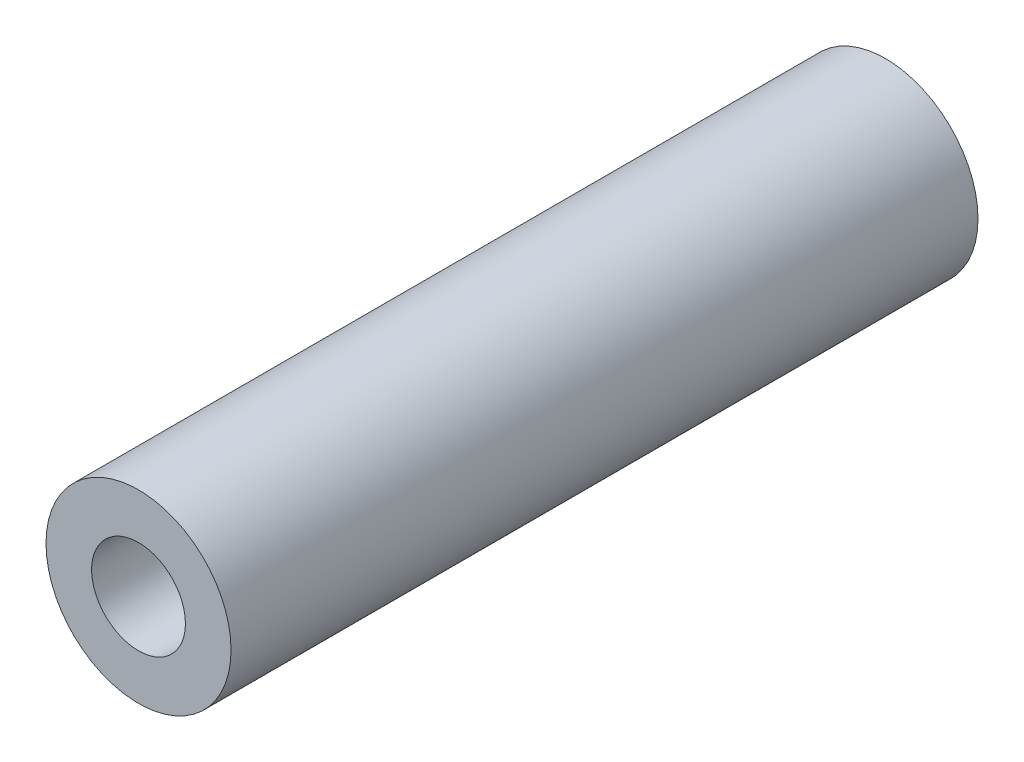
ISO-10303-21;
HEADER;
FILE_DESCRIPTION(('STEP AP214'),'2;1');
FILE_NAME('part.step','',(''),(''),'','','');
FILE_SCHEMA(('AUTOMOTIVE_DESIGN { 1 0 10303 214 1 1 1 1 }'));
ENDSEC;
DATA;
#1=APPLICATION_CONTEXT('core data for automotive mechanical design processes');
#2=APPLICATION_PROTOCOL_DEFINITION('international standard','automotive_design',2000,#1);
#3=PRODUCT_CONTEXT('',#1,'mechanical');
#4=PRODUCT('Part','Part','',(#3));
#5=PRODUCT_RELATED_PRODUCT_CATEGORY('part','',(#4));
#6=PRODUCT_DEFINITION_FORMATION('','',#4);
#7=PRODUCT_DEFINITION_CONTEXT('part definition',#1,'design');
#8=PRODUCT_DEFINITION('design','',#6,#7);
#9=PRODUCT_DEFINITION_SHAPE('','',#8);
#10=(LENGTH_UNIT() NAMED_UNIT(*) SI_UNIT(.MILLI.,.METRE.));
#11=(NAMED_UNIT(*) PLANE_ANGLE_UNIT() SI_UNIT($,.RADIAN.));
#12=(NAMED_UNIT(*) SI_UNIT($,.STERADIAN.) SOLID_ANGLE_UNIT());
#13=UNCERTAINTY_MEASURE_WITH_UNIT(LENGTH_MEASURE(1.E-05),#10,'distance_accuracy_value','');
#14=(GEOMETRIC_REPRESENTATION_CONTEXT(3) GLOBAL_UNCERTAINTY_ASSIGNED_CONTEXT((#13)) GLOBAL_UNIT_ASSIGNED_CONTEXT((#10,
#11,#12)) REPRESENTATION_CONTEXT('',''));
#15=CARTESIAN_POINT('',(0.,0.,0.));
#16=DIRECTION('',(0.,0.,1.));
#17=DIRECTION('',(1.,0.,0.));
#18=AXIS2_PLACEMENT_3D('',#15,#16,#17);
#19=CARTESIAN_POINT('',(0.,0.,63.7));
#20=DIRECTION('',(0.,0.,1.));
#21=DIRECTION('',(1.,0.,0.));
#22=AXIS2_PLACEMENT_3D('',#19,#20,#21);
#23=PLANE('',#22);
#24=CARTESIAN_POINT('',(0.,0.,63.7));
#25=DIRECTION('',(0.,0.,1.));
#26=DIRECTION('',(1.,0.,0.));
#27=AXIS2_PLACEMENT_3D('',#24,#25,#26);
#28=CIRCLE('',#27,7.89);
#29=CARTESIAN_POINT('',(7.89,0.,63.7));
#30=VERTEX_POINT('',#29);
#31=EDGE_CURVE('E10',#30,#30,#28,.T.);
#32=ORIENTED_EDGE('',*,*,#31,.T.);
#33=EDGE_LOOP('',(#32));
#34=FACE_BOUND('',#33,.T.);
#35=CARTESIAN_POINT('',(0.,0.,63.7));
#36=DIRECTION('',(0.,0.,1.));
#37=DIRECTION('',(1.,0.,0.));
#38=AXIS2_PLACEMENT_3D('',#35,#36,#37);
#39=CIRCLE('',#38,4.);
#40=CARTESIAN_POINT('',(4.,0.,63.7));
#41=VERTEX_POINT('',#40);
#42=EDGE_CURVE('E48',#41,#41,#39,.T.);
#43=ORIENTED_EDGE('',*,*,#42,.F.);
#44=EDGE_LOOP('',(#43));
#45=FACE_BOUND('',#44,.T.);
#46=ADVANCED_FACE('F37',(#34,#45),#23,.T.);
#47=CARTESIAN_POINT('',(0.,0.,0.));
#48=DIRECTION('',(0.,0.,1.));
#49=DIRECTION('',(1.,0.,0.));
#50=AXIS2_PLACEMENT_3D('',#47,#48,#49);
#51=PLANE('',#50);
#52=CARTESIAN_POINT('',(0.,0.,0.));
#53=DIRECTION('',(0.,0.,1.));
#54=DIRECTION('',(1.,0.,0.));
#55=AXIS2_PLACEMENT_3D('',#52,#53,#54);
#56=CIRCLE('',#55,7.89);
#57=CARTESIAN_POINT('',(7.89,0.,0.));
#58=VERTEX_POINT('',#57);
#59=EDGE_CURVE('E41',#58,#58,#56,.T.);
#60=ORIENTED_EDGE('',*,*,#59,.F.);
#61=EDGE_LOOP('',(#60));
#62=FACE_BOUND('',#61,.T.);
#63=CARTESIAN_POINT('',(0.,0.,0.));
#64=DIRECTION('',(0.,0.,1.));
#65=DIRECTION('',(1.,0.,0.));
#66=AXIS2_PLACEMENT_3D('',#63,#64,#65);
#67=CIRCLE('',#66,4.);
#68=CARTESIAN_POINT('',(4.,0.,0.));
#69=VERTEX_POINT('',#68);
#70=EDGE_CURVE('E50',#69,#69,#67,.T.);
#71=ORIENTED_EDGE('',*,*,#70,.T.);
#72=EDGE_LOOP('',(#71));
#73=FACE_BOUND('',#72,.T.);
#74=ADVANCED_FACE('F60',(#62,#73),#51,.F.);
#75=CARTESIAN_POINT('',(0.,0.,63.7));
#76=DIRECTION('',(0.,0.,-1.));
#77=DIRECTION('',(-1.,0.,0.));
#78=AXIS2_PLACEMENT_3D('',#75,#76,#77);
#79=CYLINDRICAL_SURFACE('',#78,7.89);
#80=ORIENTED_EDGE('',*,*,#31,.F.);
#81=EDGE_LOOP('',(#80));
#82=FACE_BOUND('',#81,.T.);
#83=ORIENTED_EDGE('',*,*,#59,.T.);
#84=EDGE_LOOP('',(#83));
#85=FACE_BOUND('',#84,.T.);
#86=ADVANCED_FACE('F39',(#82,#85),#79,.T.);
#87=CARTESIAN_POINT('',(0.,0.,63.7));
#88=DIRECTION('',(0.,0.,-1.));
#89=DIRECTION('',(-1.,0.,0.));
#90=AXIS2_PLACEMENT_3D('',#87,#88,#89);
#91=CYLINDRICAL_SURFACE('',#90,4.);
#92=ORIENTED_EDGE('',*,*,#42,.T.);
#93=EDGE_LOOP('',(#92));
#94=FACE_BOUND('',#93,.T.);
#95=ORIENTED_EDGE('',*,*,#70,.F.);
#96=EDGE_LOOP('',(#95));
#97=FACE_BOUND('',#96,.T.);
#98=ADVANCED_FACE('F56',(#94,#97),#91,.F.);
#99=CLOSED_SHELL('',(#46,#74,#86,#98));
#100=MANIFOLD_SOLID_BREP('B2',#99);
#101=ADVANCED_BREP_SHAPE_REPRESENTATION('',(#18,#100),#14);
#102=SHAPE_DEFINITION_REPRESENTATION(#9,#101);
ENDSEC;
END-ISO-10303-21;
